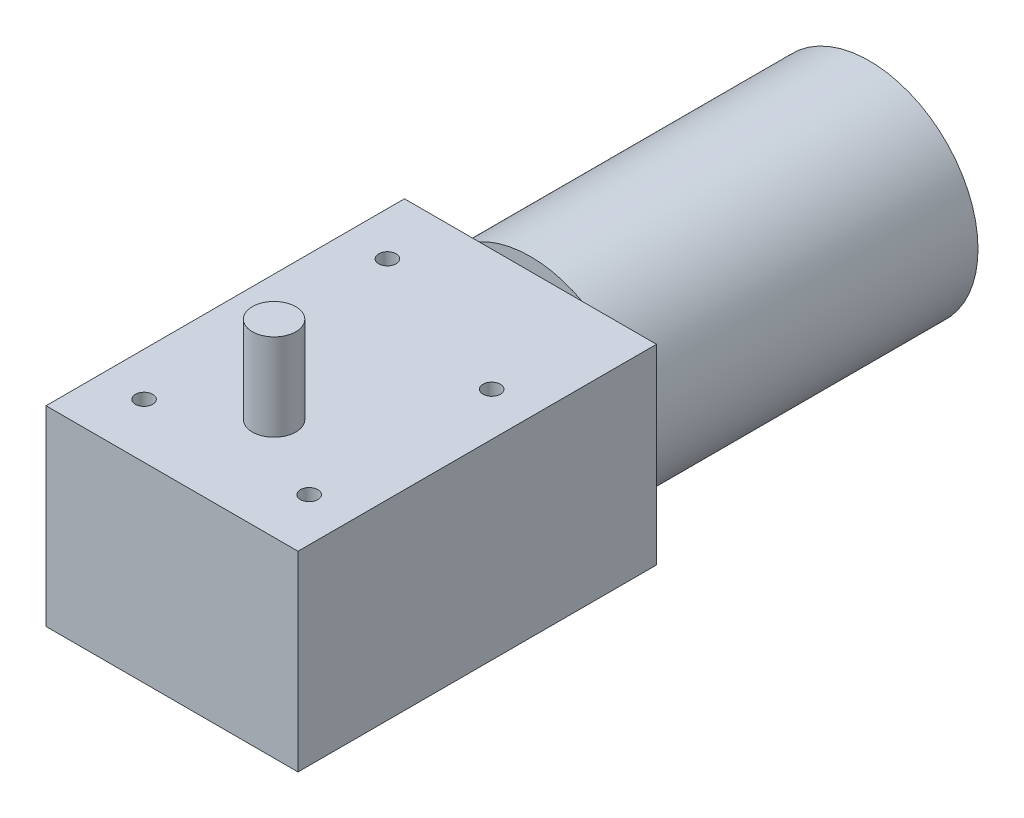
ISO-10303-21;
HEADER;
FILE_DESCRIPTION(('STEP AP214'),'2;1');
FILE_NAME('part.step','',(''),(''),'','','');
FILE_SCHEMA(('AUTOMOTIVE_DESIGN { 1 0 10303 214 1 1 1 1 }'));
ENDSEC;
DATA;
#1=APPLICATION_CONTEXT('core data for automotive mechanical design processes');
#2=APPLICATION_PROTOCOL_DEFINITION('international standard','automotive_design',2000,#1);
#3=PRODUCT_CONTEXT('',#1,'mechanical');
#4=PRODUCT('Part','Part','',(#3));
#5=PRODUCT_RELATED_PRODUCT_CATEGORY('part','',(#4));
#6=PRODUCT_DEFINITION_FORMATION('','',#4);
#7=PRODUCT_DEFINITION_CONTEXT('part definition',#1,'design');
#8=PRODUCT_DEFINITION('design','',#6,#7);
#9=PRODUCT_DEFINITION_SHAPE('','',#8);
#10=(LENGTH_UNIT() NAMED_UNIT(*) SI_UNIT(.MILLI.,.METRE.));
#11=(NAMED_UNIT(*) PLANE_ANGLE_UNIT() SI_UNIT($,.RADIAN.));
#12=(NAMED_UNIT(*) SI_UNIT($,.STERADIAN.) SOLID_ANGLE_UNIT());
#13=UNCERTAINTY_MEASURE_WITH_UNIT(LENGTH_MEASURE(1.E-05),#10,'distance_accuracy_value','');
#14=(GEOMETRIC_REPRESENTATION_CONTEXT(3) GLOBAL_UNCERTAINTY_ASSIGNED_CONTEXT((#13)) GLOBAL_UNIT_ASSIGNED_CONTEXT((#10,
#11,#12)) REPRESENTATION_CONTEXT('',''));
#15=CARTESIAN_POINT('',(0.,0.,0.));
#16=DIRECTION('',(0.,0.,1.));
#17=DIRECTION('',(1.,0.,0.));
#18=AXIS2_PLACEMENT_3D('',#15,#16,#17);
#19=CARTESIAN_POINT('',(0.,0.,78.));
#20=DIRECTION('',(0.,0.,1.));
#21=DIRECTION('',(1.,0.,0.));
#22=AXIS2_PLACEMENT_3D('',#19,#20,#21);
#23=PLANE('',#22);
#24=CARTESIAN_POINT('',(0.,0.,78.));
#25=DIRECTION('',(0.,0.,1.));
#26=DIRECTION('',(1.,0.,0.));
#27=AXIS2_PLACEMENT_3D('',#24,#25,#26);
#28=CIRCLE('',#27,25.);
#29=CARTESIAN_POINT('',(11.8743420870379,22.,78.));
#30=VERTEX_POINT('',#29);
#31=CARTESIAN_POINT('',(-11.8743420870379,22.,78.));
#32=VERTEX_POINT('',#31);
#33=EDGE_CURVE('E160',#30,#32,#28,.T.);
#34=ORIENTED_EDGE('',*,*,#33,.T.);
#35=DIRECTION('',(1.,0.,0.));
#36=VECTOR('',#35,1.);
#37=CARTESIAN_POINT('',(-29.,22.,78.));
#38=LINE('',#37,#36);
#39=EDGE_CURVE('E11',#32,#30,#38,.T.);
#40=ORIENTED_EDGE('',*,*,#39,.T.);
#41=EDGE_LOOP('',(#34,#40));
#42=FACE_BOUND('',#41,.T.);
#43=ADVANCED_FACE('F45',(#42),#23,.T.);
#44=CARTESIAN_POINT('',(0.,0.,78.));
#45=DIRECTION('',(0.,0.,-1.));
#46=DIRECTION('',(-1.,0.,0.));
#47=AXIS2_PLACEMENT_3D('',#44,#45,#46);
#48=CYLINDRICAL_SURFACE('',#47,25.);
#49=ORIENTED_EDGE('',*,*,#33,.F.);
#50=CARTESIAN_POINT('',(11.8743420870379,-22.,78.));
#51=VERTEX_POINT('',#50);
#52=EDGE_CURVE('E162',#51,#30,#28,.T.);
#53=ORIENTED_EDGE('',*,*,#52,.F.);
#54=CARTESIAN_POINT('',(-11.8743420870379,-22.,78.));
#55=VERTEX_POINT('',#54);
#56=EDGE_CURVE('E166',#55,#51,#28,.T.);
#57=ORIENTED_EDGE('',*,*,#56,.F.);
#58=EDGE_CURVE('E70',#32,#55,#28,.T.);
#59=ORIENTED_EDGE('',*,*,#58,.F.);
#60=EDGE_LOOP('',(#49,#53,#57,#59));
#61=FACE_BOUND('',#60,.T.);
#62=CARTESIAN_POINT('',(0.,0.,0.));
#63=DIRECTION('',(0.,0.,1.));
#64=DIRECTION('',(1.,0.,0.));
#65=AXIS2_PLACEMENT_3D('',#62,#63,#64);
#66=CIRCLE('',#65,25.);
#67=CARTESIAN_POINT('',(25.,0.,0.));
#68=VERTEX_POINT('',#67);
#69=EDGE_CURVE('E49',#68,#68,#66,.T.);
#70=ORIENTED_EDGE('',*,*,#69,.T.);
#71=EDGE_LOOP('',(#70));
#72=FACE_BOUND('',#71,.T.);
#73=ADVANCED_FACE('F47',(#61,#72),#48,.T.);
#74=DIRECTION('',(1.,0.,0.));
#75=VECTOR('',#74,1.);
#76=CARTESIAN_POINT('',(-29.,-22.,78.));
#77=LINE('',#76,#75);
#78=EDGE_CURVE('E55',#55,#51,#77,.T.);
#79=ORIENTED_EDGE('',*,*,#78,.F.);
#80=ORIENTED_EDGE('',*,*,#56,.T.);
#81=EDGE_LOOP('',(#79,#80));
#82=FACE_BOUND('',#81,.T.);
#83=ADVANCED_FACE('F182',(#82),#23,.T.);
#84=CARTESIAN_POINT('',(0.,0.,0.));
#85=DIRECTION('',(0.,0.,1.));
#86=DIRECTION('',(1.,0.,0.));
#87=AXIS2_PLACEMENT_3D('',#84,#85,#86);
#88=PLANE('',#87);
#89=ORIENTED_EDGE('',*,*,#69,.F.);
#90=EDGE_LOOP('',(#89));
#91=FACE_BOUND('',#90,.T.);
#92=ADVANCED_FACE('F179',(#91),#88,.F.);
#93=CARTESIAN_POINT('',(0.,0.,78.));
#94=DIRECTION('',(0.,0.,-1.));
#95=DIRECTION('',(-1.,0.,0.));
#96=AXIS2_PLACEMENT_3D('',#93,#94,#95);
#97=PLANE('',#96);
#98=CARTESIAN_POINT('',(-29.,22.,78.));
#99=VERTEX_POINT('',#98);
#100=EDGE_CURVE('E57',#99,#32,#38,.T.);
#101=ORIENTED_EDGE('',*,*,#100,.T.);
#102=ORIENTED_EDGE('',*,*,#58,.T.);
#103=CARTESIAN_POINT('',(-29.,-22.,78.));
#104=VERTEX_POINT('',#103);
#105=EDGE_CURVE('E130',#104,#55,#77,.T.);
#106=ORIENTED_EDGE('',*,*,#105,.F.);
#107=DIRECTION('',(0.,1.,0.));
#108=VECTOR('',#107,1.);
#109=CARTESIAN_POINT('',(-29.,-22.,78.));
#110=LINE('',#109,#108);
#111=EDGE_CURVE('E144',#104,#99,#110,.T.);
#112=ORIENTED_EDGE('',*,*,#111,.T.);
#113=EDGE_LOOP('',(#101,#102,#106,#112));
#114=FACE_BOUND('',#113,.T.);
#115=ADVANCED_FACE('F181',(#114),#97,.T.);
#116=CARTESIAN_POINT('',(-29.,-22.,160.5));
#117=DIRECTION('',(-1.,0.,0.));
#118=DIRECTION('',(0.,0.,1.));
#119=AXIS2_PLACEMENT_3D('',#116,#117,#118);
#120=PLANE('',#119);
#121=ORIENTED_EDGE('',*,*,#111,.F.);
#122=DIRECTION('',(0.,0.,-1.));
#123=VECTOR('',#122,1.);
#124=CARTESIAN_POINT('',(-29.,-22.,160.5));
#125=LINE('',#124,#123);
#126=CARTESIAN_POINT('',(-29.,-22.,160.5));
#127=VERTEX_POINT('',#126);
#128=EDGE_CURVE('E127',#127,#104,#125,.T.);
#129=ORIENTED_EDGE('',*,*,#128,.F.);
#130=DIRECTION('',(0.,1.,0.));
#131=VECTOR('',#130,1.);
#132=CARTESIAN_POINT('',(-29.,-22.,160.5));
#133=LINE('',#132,#131);
#134=CARTESIAN_POINT('',(-29.,22.,160.5));
#135=VERTEX_POINT('',#134);
#136=EDGE_CURVE('E120',#127,#135,#133,.T.);
#137=ORIENTED_EDGE('',*,*,#136,.T.);
#138=DIRECTION('',(0.,0.,-1.));
#139=VECTOR('',#138,1.);
#140=CARTESIAN_POINT('',(-29.,22.,160.5));
#141=LINE('',#140,#139);
#142=EDGE_CURVE('E102',#135,#99,#141,.T.);
#143=ORIENTED_EDGE('',*,*,#142,.T.);
#144=EDGE_LOOP('',(#121,#129,#137,#143));
#145=FACE_BOUND('',#144,.T.);
#146=ADVANCED_FACE('F126',(#145),#120,.T.);
#147=CARTESIAN_POINT('',(-29.,-22.,160.5));
#148=DIRECTION('',(0.,1.,0.));
#149=DIRECTION('',(-1.,0.,0.));
#150=AXIS2_PLACEMENT_3D('',#147,#148,#149);
#151=PLANE('',#150);
#152=CARTESIAN_POINT('',(-19.,-22.,91.93));
#153=DIRECTION('',(0.,1.,0.));
#154=DIRECTION('',(-1.,0.,0.));
#155=AXIS2_PLACEMENT_3D('',#152,#153,#154);
#156=CIRCLE('',#155,2.);
#157=CARTESIAN_POINT('',(-21.,-22.,91.93));
#158=VERTEX_POINT('',#157);
#159=EDGE_CURVE('E243',#158,#158,#156,.T.);
#160=ORIENTED_EDGE('',*,*,#159,.T.);
#161=EDGE_LOOP('',(#160));
#162=FACE_BOUND('',#161,.T.);
#163=CARTESIAN_POINT('',(19.,-22.,105.92));
#164=DIRECTION('',(0.,1.,0.));
#165=DIRECTION('',(-1.,0.,0.));
#166=AXIS2_PLACEMENT_3D('',#163,#164,#165);
#167=CIRCLE('',#166,2.00000000000001);
#168=CARTESIAN_POINT('',(17.,-22.,105.92));
#169=VERTEX_POINT('',#168);
#170=EDGE_CURVE('E245',#169,#169,#167,.T.);
#171=ORIENTED_EDGE('',*,*,#170,.T.);
#172=EDGE_LOOP('',(#171));
#173=FACE_BOUND('',#172,.T.);
#174=CARTESIAN_POINT('',(19.,-22.,147.94));
#175=DIRECTION('',(0.,1.,0.));
#176=DIRECTION('',(-1.,0.,0.));
#177=AXIS2_PLACEMENT_3D('',#174,#175,#176);
#178=CIRCLE('',#177,2.);
#179=CARTESIAN_POINT('',(17.,-22.,147.94));
#180=VERTEX_POINT('',#179);
#181=EDGE_CURVE('E251',#180,#180,#178,.T.);
#182=ORIENTED_EDGE('',*,*,#181,.T.);
#183=EDGE_LOOP('',(#182));
#184=FACE_BOUND('',#183,.T.);
#185=CARTESIAN_POINT('',(-19.,-22.,147.94));
#186=DIRECTION('',(0.,1.,0.));
#187=DIRECTION('',(-1.,0.,0.));
#188=AXIS2_PLACEMENT_3D('',#185,#186,#187);
#189=CIRCLE('',#188,2.);
#190=CARTESIAN_POINT('',(-21.,-22.,147.94));
#191=VERTEX_POINT('',#190);
#192=EDGE_CURVE('E269',#191,#191,#189,.T.);
#193=ORIENTED_EDGE('',*,*,#192,.T.);
#194=EDGE_LOOP('',(#193));
#195=FACE_BOUND('',#194,.T.);
#196=ORIENTED_EDGE('',*,*,#105,.T.);
#197=ORIENTED_EDGE('',*,*,#78,.T.);
#198=CARTESIAN_POINT('',(29.,-22.,78.));
#199=VERTEX_POINT('',#198);
#200=EDGE_CURVE('E134',#51,#199,#77,.T.);
#201=ORIENTED_EDGE('',*,*,#200,.T.);
#202=DIRECTION('',(0.,0.,-1.));
#203=VECTOR('',#202,1.);
#204=CARTESIAN_POINT('',(29.,-22.,160.5));
#205=LINE('',#204,#203);
#206=CARTESIAN_POINT('',(29.,-22.,160.5));
#207=VERTEX_POINT('',#206);
#208=EDGE_CURVE('E155',#207,#199,#205,.T.);
#209=ORIENTED_EDGE('',*,*,#208,.F.);
#210=DIRECTION('',(1.,0.,0.));
#211=VECTOR('',#210,1.);
#212=CARTESIAN_POINT('',(-29.,-22.,160.5));
#213=LINE('',#212,#211);
#214=EDGE_CURVE('E115',#127,#207,#213,.T.);
#215=ORIENTED_EDGE('',*,*,#214,.F.);
#216=ORIENTED_EDGE('',*,*,#128,.T.);
#217=EDGE_LOOP('',(#196,#197,#201,#209,#215,#216));
#218=FACE_BOUND('',#217,.T.);
#219=ADVANCED_FACE('F198',(#162,#173,#184,#195,#218),#151,.F.);
#220=CARTESIAN_POINT('',(29.,-22.,160.5));
#221=DIRECTION('',(-1.,0.,0.));
#222=DIRECTION('',(0.,-1.,0.));
#223=AXIS2_PLACEMENT_3D('',#220,#221,#222);
#224=PLANE('',#223);
#225=DIRECTION('',(0.,1.,0.));
#226=VECTOR('',#225,1.);
#227=CARTESIAN_POINT('',(29.,-22.,78.));
#228=LINE('',#227,#226);
#229=CARTESIAN_POINT('',(29.,22.,78.));
#230=VERTEX_POINT('',#229);
#231=EDGE_CURVE('E149',#199,#230,#228,.T.);
#232=ORIENTED_EDGE('',*,*,#231,.T.);
#233=DIRECTION('',(0.,0.,-1.));
#234=VECTOR('',#233,1.);
#235=CARTESIAN_POINT('',(29.,22.,160.5));
#236=LINE('',#235,#234);
#237=CARTESIAN_POINT('',(29.,22.,160.5));
#238=VERTEX_POINT('',#237);
#239=EDGE_CURVE('E114',#238,#230,#236,.T.);
#240=ORIENTED_EDGE('',*,*,#239,.F.);
#241=DIRECTION('',(0.,1.,0.));
#242=VECTOR('',#241,1.);
#243=CARTESIAN_POINT('',(29.,-22.,160.5));
#244=LINE('',#243,#242);
#245=EDGE_CURVE('E122',#207,#238,#244,.T.);
#246=ORIENTED_EDGE('',*,*,#245,.F.);
#247=ORIENTED_EDGE('',*,*,#208,.T.);
#248=EDGE_LOOP('',(#232,#240,#246,#247));
#249=FACE_BOUND('',#248,.T.);
#250=ADVANCED_FACE('F201',(#249),#224,.F.);
#251=CARTESIAN_POINT('',(-29.,22.,160.5));
#252=DIRECTION('',(0.,1.,0.));
#253=DIRECTION('',(0.,0.,1.));
#254=AXIS2_PLACEMENT_3D('',#251,#252,#253);
#255=PLANE('',#254);
#256=CARTESIAN_POINT('',(-19.,22.,91.93));
#257=DIRECTION('',(0.,1.,0.));
#258=DIRECTION('',(0.,0.,1.));
#259=AXIS2_PLACEMENT_3D('',#256,#257,#258);
#260=CIRCLE('',#259,2.);
#261=CARTESIAN_POINT('',(-19.,22.,93.93));
#262=VERTEX_POINT('',#261);
#263=EDGE_CURVE('E240',#262,#262,#260,.T.);
#264=ORIENTED_EDGE('',*,*,#263,.F.);
#265=EDGE_LOOP('',(#264));
#266=FACE_BOUND('',#265,.T.);
#267=CARTESIAN_POINT('',(19.,22.,105.92));
#268=DIRECTION('',(0.,1.,0.));
#269=DIRECTION('',(0.,0.,1.));
#270=AXIS2_PLACEMENT_3D('',#267,#268,#269);
#271=CIRCLE('',#270,2.00000000000001);
#272=CARTESIAN_POINT('',(19.,22.,107.92));
#273=VERTEX_POINT('',#272);
#274=EDGE_CURVE('E281',#273,#273,#271,.T.);
#275=ORIENTED_EDGE('',*,*,#274,.F.);
#276=EDGE_LOOP('',(#275));
#277=FACE_BOUND('',#276,.T.);
#278=CARTESIAN_POINT('',(19.,22.,147.94));
#279=DIRECTION('',(0.,1.,0.));
#280=DIRECTION('',(0.,0.,1.));
#281=AXIS2_PLACEMENT_3D('',#278,#279,#280);
#282=CIRCLE('',#281,2.);
#283=CARTESIAN_POINT('',(19.,22.,149.94));
#284=VERTEX_POINT('',#283);
#285=EDGE_CURVE('E277',#284,#284,#282,.T.);
#286=ORIENTED_EDGE('',*,*,#285,.F.);
#287=EDGE_LOOP('',(#286));
#288=FACE_BOUND('',#287,.T.);
#289=CARTESIAN_POINT('',(-19.,22.,147.94));
#290=DIRECTION('',(0.,1.,0.));
#291=DIRECTION('',(0.,0.,1.));
#292=AXIS2_PLACEMENT_3D('',#289,#290,#291);
#293=CIRCLE('',#292,2.);
#294=CARTESIAN_POINT('',(-19.,22.,149.94));
#295=VERTEX_POINT('',#294);
#296=EDGE_CURVE('E273',#295,#295,#293,.T.);
#297=ORIENTED_EDGE('',*,*,#296,.F.);
#298=EDGE_LOOP('',(#297));
#299=FACE_BOUND('',#298,.T.);
#300=CARTESIAN_POINT('',(0.,22.,137.));
#301=DIRECTION('',(0.,1.,0.));
#302=DIRECTION('',(0.,0.,1.));
#303=AXIS2_PLACEMENT_3D('',#300,#301,#302);
#304=CIRCLE('',#303,5.);
#305=CARTESIAN_POINT('',(0.,22.,142.));
#306=VERTEX_POINT('',#305);
#307=EDGE_CURVE('E137',#306,#306,#304,.T.);
#308=ORIENTED_EDGE('',*,*,#307,.F.);
#309=EDGE_LOOP('',(#308));
#310=FACE_BOUND('',#309,.T.);
#311=ORIENTED_EDGE('',*,*,#100,.F.);
#312=ORIENTED_EDGE('',*,*,#142,.F.);
#313=DIRECTION('',(1.,0.,0.));
#314=VECTOR('',#313,1.);
#315=CARTESIAN_POINT('',(-29.,22.,160.5));
#316=LINE('',#315,#314);
#317=EDGE_CURVE('E106',#135,#238,#316,.T.);
#318=ORIENTED_EDGE('',*,*,#317,.T.);
#319=ORIENTED_EDGE('',*,*,#239,.T.);
#320=EDGE_CURVE('E58',#30,#230,#38,.T.);
#321=ORIENTED_EDGE('',*,*,#320,.F.);
#322=ORIENTED_EDGE('',*,*,#39,.F.);
#323=EDGE_LOOP('',(#311,#312,#318,#319,#321,#322));
#324=FACE_BOUND('',#323,.T.);
#325=ADVANCED_FACE('F104',(#266,#277,#288,#299,#310,#324),#255,.T.);
#326=CARTESIAN_POINT('',(0.,0.,160.5));
#327=DIRECTION('',(0.,0.,-1.));
#328=DIRECTION('',(-1.,0.,0.));
#329=AXIS2_PLACEMENT_3D('',#326,#327,#328);
#330=PLANE('',#329);
#331=ORIENTED_EDGE('',*,*,#136,.F.);
#332=ORIENTED_EDGE('',*,*,#214,.T.);
#333=ORIENTED_EDGE('',*,*,#245,.T.);
#334=ORIENTED_EDGE('',*,*,#317,.F.);
#335=EDGE_LOOP('',(#331,#332,#333,#334));
#336=FACE_BOUND('',#335,.T.);
#337=ADVANCED_FACE('F119',(#336),#330,.F.);
#338=ORIENTED_EDGE('',*,*,#200,.F.);
#339=ORIENTED_EDGE('',*,*,#52,.T.);
#340=ORIENTED_EDGE('',*,*,#320,.T.);
#341=ORIENTED_EDGE('',*,*,#231,.F.);
#342=EDGE_LOOP('',(#338,#339,#340,#341));
#343=FACE_BOUND('',#342,.T.);
#344=ADVANCED_FACE('F189',(#343),#97,.T.);
#345=CARTESIAN_POINT('',(0.,42.,137.));
#346=DIRECTION('',(0.,-1.,0.));
#347=DIRECTION('',(0.,0.,-1.));
#348=AXIS2_PLACEMENT_3D('',#345,#346,#347);
#349=CYLINDRICAL_SURFACE('',#348,5.);
#350=CARTESIAN_POINT('',(0.,42.,137.));
#351=DIRECTION('',(0.,1.,0.));
#352=DIRECTION('',(0.,0.,1.));
#353=AXIS2_PLACEMENT_3D('',#350,#351,#352);
#354=CIRCLE('',#353,5.);
#355=CARTESIAN_POINT('',(0.,42.,142.));
#356=VERTEX_POINT('',#355);
#357=EDGE_CURVE('E146',#356,#356,#354,.T.);
#358=ORIENTED_EDGE('',*,*,#357,.F.);
#359=EDGE_LOOP('',(#358));
#360=FACE_BOUND('',#359,.T.);
#361=ORIENTED_EDGE('',*,*,#307,.T.);
#362=EDGE_LOOP('',(#361));
#363=FACE_BOUND('',#362,.T.);
#364=ADVANCED_FACE('F210',(#360,#363),#349,.T.);
#365=CARTESIAN_POINT('',(0.,42.,137.));
#366=DIRECTION('',(0.,1.,0.));
#367=DIRECTION('',(0.,0.,1.));
#368=AXIS2_PLACEMENT_3D('',#365,#366,#367);
#369=PLANE('',#368);
#370=ORIENTED_EDGE('',*,*,#357,.T.);
#371=EDGE_LOOP('',(#370));
#372=FACE_BOUND('',#371,.T.);
#373=ADVANCED_FACE('F215',(#372),#369,.T.);
#374=CARTESIAN_POINT('',(-19.,-25.,147.94));
#375=DIRECTION('',(0.,1.,0.));
#376=DIRECTION('',(0.,0.,1.));
#377=AXIS2_PLACEMENT_3D('',#374,#375,#376);
#378=CYLINDRICAL_SURFACE('',#377,2.);
#379=ORIENTED_EDGE('',*,*,#296,.T.);
#380=EDGE_LOOP('',(#379));
#381=FACE_BOUND('',#380,.T.);
#382=ORIENTED_EDGE('',*,*,#192,.F.);
#383=EDGE_LOOP('',(#382));
#384=FACE_BOUND('',#383,.T.);
#385=ADVANCED_FACE('F219',(#381,#384),#378,.F.);
#386=CARTESIAN_POINT('',(19.,-25.,147.94));
#387=DIRECTION('',(0.,1.,0.));
#388=DIRECTION('',(0.,0.,1.));
#389=AXIS2_PLACEMENT_3D('',#386,#387,#388);
#390=CYLINDRICAL_SURFACE('',#389,2.);
#391=ORIENTED_EDGE('',*,*,#285,.T.);
#392=EDGE_LOOP('',(#391));
#393=FACE_BOUND('',#392,.T.);
#394=ORIENTED_EDGE('',*,*,#181,.F.);
#395=EDGE_LOOP('',(#394));
#396=FACE_BOUND('',#395,.T.);
#397=ADVANCED_FACE('F223',(#393,#396),#390,.F.);
#398=CARTESIAN_POINT('',(19.,-25.,105.92));
#399=DIRECTION('',(0.,1.,0.));
#400=DIRECTION('',(0.,0.,1.));
#401=AXIS2_PLACEMENT_3D('',#398,#399,#400);
#402=CYLINDRICAL_SURFACE('',#401,2.00000000000001);
#403=ORIENTED_EDGE('',*,*,#274,.T.);
#404=EDGE_LOOP('',(#403));
#405=FACE_BOUND('',#404,.T.);
#406=ORIENTED_EDGE('',*,*,#170,.F.);
#407=EDGE_LOOP('',(#406));
#408=FACE_BOUND('',#407,.T.);
#409=ADVANCED_FACE('F227',(#405,#408),#402,.F.);
#410=CARTESIAN_POINT('',(-19.,-25.,91.93));
#411=DIRECTION('',(0.,1.,0.));
#412=DIRECTION('',(0.,0.,1.));
#413=AXIS2_PLACEMENT_3D('',#410,#411,#412);
#414=CYLINDRICAL_SURFACE('',#413,2.);
#415=ORIENTED_EDGE('',*,*,#263,.T.);
#416=EDGE_LOOP('',(#415));
#417=FACE_BOUND('',#416,.T.);
#418=ORIENTED_EDGE('',*,*,#159,.F.);
#419=EDGE_LOOP('',(#418));
#420=FACE_BOUND('',#419,.T.);
#421=ADVANCED_FACE('F231',(#417,#420),#414,.F.);
#422=CLOSED_SHELL('',(#43,#73,#83,#92,#115,#146,#219,#250,#325,#337,#344,#364,#373,#385,#397,
#409,#421));
#423=MANIFOLD_SOLID_BREP('B2',#422);
#424=ADVANCED_BREP_SHAPE_REPRESENTATION('',(#18,#423),#14);
#425=SHAPE_DEFINITION_REPRESENTATION(#9,#424);
ENDSEC;
END-ISO-10303-21;
